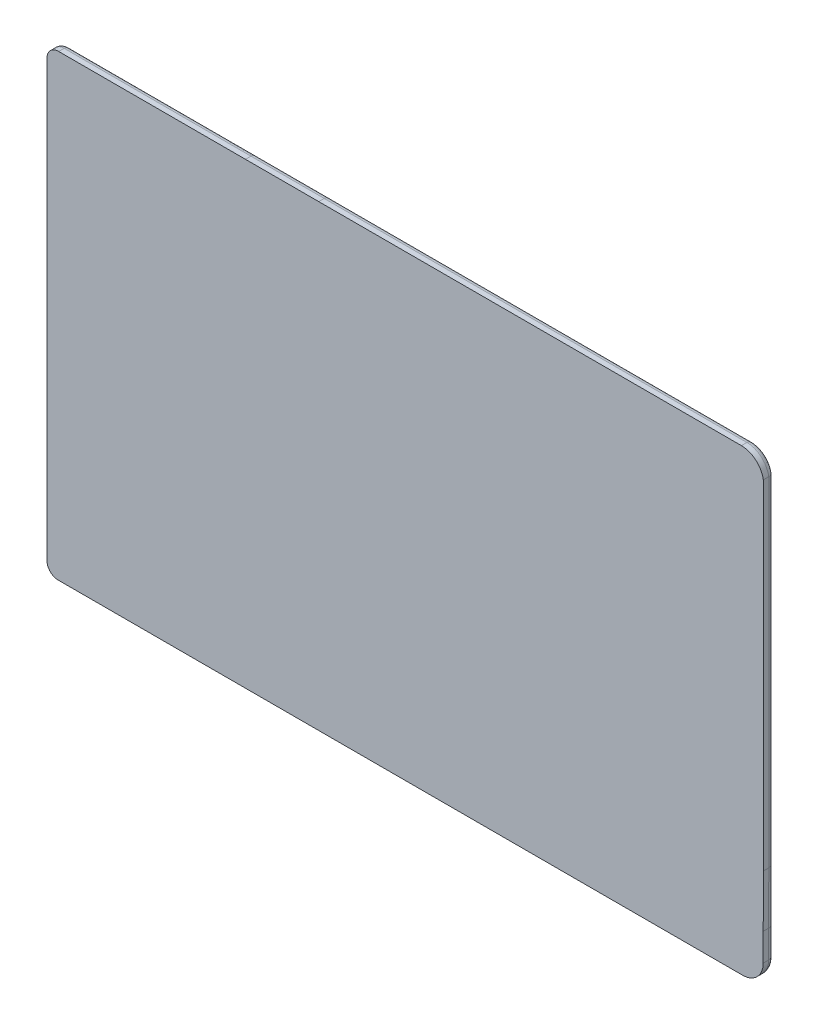
ISO-10303-21;
HEADER;
FILE_DESCRIPTION(('STEP AP214'),'2;1');
FILE_NAME('part.step','',(''),(''),'','','');
FILE_SCHEMA(('AUTOMOTIVE_DESIGN { 1 0 10303 214 1 1 1 1 }'));
ENDSEC;
DATA;
#1=APPLICATION_CONTEXT('core data for automotive mechanical design processes');
#2=APPLICATION_PROTOCOL_DEFINITION('international standard','automotive_design',2000,#1);
#3=PRODUCT_CONTEXT('',#1,'mechanical');
#4=PRODUCT('Part','Part','',(#3));
#5=PRODUCT_RELATED_PRODUCT_CATEGORY('part','',(#4));
#6=PRODUCT_DEFINITION_FORMATION('','',#4);
#7=PRODUCT_DEFINITION_CONTEXT('part definition',#1,'design');
#8=PRODUCT_DEFINITION('design','',#6,#7);
#9=PRODUCT_DEFINITION_SHAPE('','',#8);
#10=(LENGTH_UNIT() NAMED_UNIT(*) SI_UNIT(.MILLI.,.METRE.));
#11=(NAMED_UNIT(*) PLANE_ANGLE_UNIT() SI_UNIT($,.RADIAN.));
#12=(NAMED_UNIT(*) SI_UNIT($,.STERADIAN.) SOLID_ANGLE_UNIT());
#13=UNCERTAINTY_MEASURE_WITH_UNIT(LENGTH_MEASURE(1.E-05),#10,'distance_accuracy_value','');
#14=(GEOMETRIC_REPRESENTATION_CONTEXT(3) GLOBAL_UNCERTAINTY_ASSIGNED_CONTEXT((#13)) GLOBAL_UNIT_ASSIGNED_CONTEXT((#10,
#11,#12)) REPRESENTATION_CONTEXT('',''));
#15=CARTESIAN_POINT('',(0.,0.,0.));
#16=DIRECTION('',(0.,0.,1.));
#17=DIRECTION('',(1.,0.,0.));
#18=AXIS2_PLACEMENT_3D('',#15,#16,#17);
#19=CARTESIAN_POINT('',(-23.7559458215507,0.,2.));
#20=DIRECTION('',(1.,0.,0.));
#21=DIRECTION('',(0.,0.,-1.));
#22=AXIS2_PLACEMENT_3D('',#19,#20,#21);
#23=PLANE('',#22);
#24=DIRECTION('',(0.,0.,-1.));
#25=VECTOR('',#24,1.);
#26=CARTESIAN_POINT('',(-23.7559458215503,15.1458088728289,2.));
#27=LINE('',#26,#25);
#28=CARTESIAN_POINT('',(-23.7559458215503,15.1458088728289,2.));
#29=VERTEX_POINT('',#28);
#30=CARTESIAN_POINT('',(-23.7559458215503,15.1458088728289,1.));
#31=VERTEX_POINT('',#30);
#32=EDGE_CURVE('E684',#29,#31,#27,.T.);
#33=ORIENTED_EDGE('',*,*,#32,.T.);
#34=DIRECTION('',(0.,-1.,0.));
#35=VECTOR('',#34,1.);
#36=CARTESIAN_POINT('',(-23.7559458215507,0.,1.));
#37=LINE('',#36,#35);
#38=CARTESIAN_POINT('',(-23.7559458215507,-64.437268727397,1.));
#39=VERTEX_POINT('',#38);
#40=EDGE_CURVE('E11',#31,#39,#37,.T.);
#41=ORIENTED_EDGE('',*,*,#40,.T.);
#42=DIRECTION('',(0.,0.,-1.));
#43=VECTOR('',#42,1.);
#44=CARTESIAN_POINT('',(-23.7559458215507,-64.437268727397,2.));
#45=LINE('',#44,#43);
#46=CARTESIAN_POINT('',(-23.7559458215507,-64.437268727397,2.));
#47=VERTEX_POINT('',#46);
#48=EDGE_CURVE('E169',#47,#39,#45,.T.);
#49=ORIENTED_EDGE('',*,*,#48,.F.);
#50=DIRECTION('',(0.,-1.,0.));
#51=VECTOR('',#50,1.);
#52=CARTESIAN_POINT('',(-23.7559458215507,0.,2.));
#53=LINE('',#52,#51);
#54=EDGE_CURVE('E176',#29,#47,#53,.T.);
#55=ORIENTED_EDGE('',*,*,#54,.F.);
#56=EDGE_LOOP('',(#33,#41,#49,#55));
#57=FACE_BOUND('',#56,.T.);
#58=ADVANCED_FACE('F37',(#57),#23,.F.);
#59=CARTESIAN_POINT('',(-21.6951147542811,-64.437268727397,2.));
#60=DIRECTION('',(0.,0.,-1.));
#61=DIRECTION('',(-1.,0.,0.));
#62=AXIS2_PLACEMENT_3D('',#59,#60,#61);
#63=CYLINDRICAL_SURFACE('',#62,2.06083106726956);
#64=ORIENTED_EDGE('',*,*,#48,.T.);
#65=CARTESIAN_POINT('',(-21.6951147542811,-64.437268727397,1.));
#66=DIRECTION('',(0.,0.,1.));
#67=DIRECTION('',(1.,0.,0.));
#68=AXIS2_PLACEMENT_3D('',#65,#66,#67);
#69=CIRCLE('',#68,2.06083106726956);
#70=CARTESIAN_POINT('',(-21.7196508215789,-66.497953727397,1.));
#71=VERTEX_POINT('',#70);
#72=EDGE_CURVE('E186',#39,#71,#69,.T.);
#73=ORIENTED_EDGE('',*,*,#72,.T.);
#74=DIRECTION('',(0.,0.,-1.));
#75=VECTOR('',#74,1.);
#76=CARTESIAN_POINT('',(-21.7196508215789,-66.497953727397,2.));
#77=LINE('',#76,#75);
#78=CARTESIAN_POINT('',(-21.7196508215789,-66.497953727397,2.));
#79=VERTEX_POINT('',#78);
#80=EDGE_CURVE('E172',#79,#71,#77,.T.);
#81=ORIENTED_EDGE('',*,*,#80,.F.);
#82=CARTESIAN_POINT('',(-21.6951147542811,-64.437268727397,2.));
#83=DIRECTION('',(0.,0.,1.));
#84=DIRECTION('',(1.,0.,0.));
#85=AXIS2_PLACEMENT_3D('',#82,#83,#84);
#86=CIRCLE('',#85,2.06083106726956);
#87=EDGE_CURVE('E164',#47,#79,#86,.T.);
#88=ORIENTED_EDGE('',*,*,#87,.F.);
#89=EDGE_LOOP('',(#64,#73,#81,#88));
#90=FACE_BOUND('',#89,.T.);
#91=ADVANCED_FACE('F166',(#90),#63,.T.);
#92=CARTESIAN_POINT('',(0.,-66.497953727397,2.));
#93=DIRECTION('',(0.,1.,0.));
#94=DIRECTION('',(0.,0.,1.));
#95=AXIS2_PLACEMENT_3D('',#92,#93,#94);
#96=PLANE('',#95);
#97=ORIENTED_EDGE('',*,*,#80,.T.);
#98=DIRECTION('',(1.,0.,0.));
#99=VECTOR('',#98,1.);
#100=CARTESIAN_POINT('',(0.,-66.497953727397,1.));
#101=LINE('',#100,#99);
#102=CARTESIAN_POINT('',(103.24205417845,-66.497953727397,1.));
#103=VERTEX_POINT('',#102);
#104=EDGE_CURVE('E218',#71,#103,#101,.T.);
#105=ORIENTED_EDGE('',*,*,#104,.T.);
#106=DIRECTION('',(0.,0.,-1.));
#107=VECTOR('',#106,1.);
#108=CARTESIAN_POINT('',(103.24205417845,-66.497953727397,2.));
#109=LINE('',#108,#107);
#110=CARTESIAN_POINT('',(103.24205417845,-66.497953727397,2.));
#111=VERTEX_POINT('',#110);
#112=EDGE_CURVE('E190',#111,#103,#109,.T.);
#113=ORIENTED_EDGE('',*,*,#112,.F.);
#114=DIRECTION('',(1.,0.,0.));
#115=VECTOR('',#114,1.);
#116=CARTESIAN_POINT('',(0.,-66.497953727397,2.));
#117=LINE('',#116,#115);
#118=EDGE_CURVE('E175',#79,#111,#117,.T.);
#119=ORIENTED_EDGE('',*,*,#118,.F.);
#120=EDGE_LOOP('',(#97,#105,#113,#119));
#121=FACE_BOUND('',#120,.T.);
#122=ADVANCED_FACE('F419',(#121),#96,.F.);
#123=CARTESIAN_POINT('',(103.423842226485,-62.693713227397,2.));
#124=DIRECTION('',(0.,0.,-1.));
#125=DIRECTION('',(-1.,0.,0.));
#126=AXIS2_PLACEMENT_3D('',#123,#124,#125);
#127=CYLINDRICAL_SURFACE('',#126,3.80858145196458);
#128=ORIENTED_EDGE('',*,*,#112,.T.);
#129=CARTESIAN_POINT('',(103.423842226485,-62.693713227397,1.));
#130=DIRECTION('',(0.,0.,1.));
#131=DIRECTION('',(1.,0.,0.));
#132=AXIS2_PLACEMENT_3D('',#129,#130,#131);
#133=CIRCLE('',#132,3.80858145196458);
#134=CARTESIAN_POINT('',(107.23242367845,-62.693713227397,1.));
#135=VERTEX_POINT('',#134);
#136=EDGE_CURVE('E220',#103,#135,#133,.T.);
#137=ORIENTED_EDGE('',*,*,#136,.T.);
#138=DIRECTION('',(0.,0.,-1.));
#139=VECTOR('',#138,1.);
#140=CARTESIAN_POINT('',(107.23242367845,-62.693713227397,2.));
#141=LINE('',#140,#139);
#142=CARTESIAN_POINT('',(107.23242367845,-62.693713227397,2.));
#143=VERTEX_POINT('',#142);
#144=EDGE_CURVE('E381',#143,#135,#141,.T.);
#145=ORIENTED_EDGE('',*,*,#144,.F.);
#146=CARTESIAN_POINT('',(103.423842226485,-62.693713227397,2.));
#147=DIRECTION('',(0.,0.,1.));
#148=DIRECTION('',(1.,0.,0.));
#149=AXIS2_PLACEMENT_3D('',#146,#147,#148);
#150=CIRCLE('',#149,3.80858145196458);
#151=EDGE_CURVE('E390',#143,#111,#150,.F.);
#152=ORIENTED_EDGE('',*,*,#151,.T.);
#153=EDGE_LOOP('',(#128,#137,#145,#152));
#154=FACE_BOUND('',#153,.T.);
#155=ADVANCED_FACE('F388',(#154),#127,.T.);
#156=CARTESIAN_POINT('',(107.23242367845,0.,2.));
#157=DIRECTION('',(-1.,0.,0.));
#158=DIRECTION('',(0.,0.,1.));
#159=AXIS2_PLACEMENT_3D('',#156,#157,#158);
#160=PLANE('',#159);
#161=ORIENTED_EDGE('',*,*,#144,.T.);
#162=DIRECTION('',(0.,1.,0.));
#163=VECTOR('',#162,1.);
#164=CARTESIAN_POINT('',(107.23242367845,0.,1.));
#165=LINE('',#164,#163);
#166=CARTESIAN_POINT('',(107.23242367845,-57.6479667005713,1.));
#167=VERTEX_POINT('',#166);
#168=EDGE_CURVE('E222',#135,#167,#165,.T.);
#169=ORIENTED_EDGE('',*,*,#168,.T.);
#170=DIRECTION('',(0.,0.,-1.));
#171=VECTOR('',#170,1.);
#172=CARTESIAN_POINT('',(107.23242367845,-57.6479667005713,2.));
#173=LINE('',#172,#171);
#174=CARTESIAN_POINT('',(107.23242367845,-57.6479667005713,2.));
#175=VERTEX_POINT('',#174);
#176=EDGE_CURVE('E344',#175,#167,#173,.T.);
#177=ORIENTED_EDGE('',*,*,#176,.F.);
#178=DIRECTION('',(0.,1.,0.));
#179=VECTOR('',#178,1.);
#180=CARTESIAN_POINT('',(107.23242367845,0.,2.));
#181=LINE('',#180,#179);
#182=EDGE_CURVE('E700',#143,#175,#181,.T.);
#183=ORIENTED_EDGE('',*,*,#182,.F.);
#184=EDGE_LOOP('',(#161,#169,#177,#183));
#185=FACE_BOUND('',#184,.T.);
#186=ADVANCED_FACE('F426',(#185),#160,.F.);
#187=CARTESIAN_POINT('',(107.290484521769,-0.108262217670973,2.));
#188=DIRECTION('',(-0.999999490902344,0.0010090565164049,0.));
#189=DIRECTION('',(-0.0010090565164049,-0.999999490902344,0.));
#190=AXIS2_PLACEMENT_3D('',#187,#188,#189);
#191=PLANE('',#190);
#192=ORIENTED_EDGE('',*,*,#176,.T.);
#193=DIRECTION('',(0.0010090565164049,0.999999490902344,0.));
#194=VECTOR('',#193,1.);
#195=CARTESIAN_POINT('',(107.290484521769,-0.108262217670973,1.));
#196=LINE('',#195,#194);
#197=CARTESIAN_POINT('',(107.24205417845,-48.1039075318432,1.));
#198=VERTEX_POINT('',#197);
#199=EDGE_CURVE('E224',#167,#198,#196,.T.);
#200=ORIENTED_EDGE('',*,*,#199,.T.);
#201=DIRECTION('',(0.,0.,-1.));
#202=VECTOR('',#201,1.);
#203=CARTESIAN_POINT('',(107.24205417845,-48.1039075318432,2.));
#204=LINE('',#203,#202);
#205=CARTESIAN_POINT('',(107.24205417845,-48.1039075318432,2.));
#206=VERTEX_POINT('',#205);
#207=EDGE_CURVE('E341',#206,#198,#204,.T.);
#208=ORIENTED_EDGE('',*,*,#207,.F.);
#209=DIRECTION('',(0.0010090565164049,0.999999490902344,0.));
#210=VECTOR('',#209,1.);
#211=CARTESIAN_POINT('',(107.290484521769,-0.108262217670973,2.));
#212=LINE('',#211,#210);
#213=EDGE_CURVE('E698',#175,#206,#212,.T.);
#214=ORIENTED_EDGE('',*,*,#213,.F.);
#215=EDGE_LOOP('',(#192,#200,#208,#214));
#216=FACE_BOUND('',#215,.T.);
#217=ADVANCED_FACE('F339',(#216),#191,.F.);
#218=CARTESIAN_POINT('',(107.24205417845,0.,2.));
#219=DIRECTION('',(-1.,0.,0.));
#220=DIRECTION('',(0.,0.,1.));
#221=AXIS2_PLACEMENT_3D('',#218,#219,#220);
#222=PLANE('',#221);
#223=ORIENTED_EDGE('',*,*,#207,.T.);
#224=DIRECTION('',(0.,1.,0.));
#225=VECTOR('',#224,1.);
#226=CARTESIAN_POINT('',(107.24205417845,0.,1.));
#227=LINE('',#226,#225);
#228=CARTESIAN_POINT('',(107.24205417845,13.858111772603,1.));
#229=VERTEX_POINT('',#228);
#230=EDGE_CURVE('E226',#198,#229,#227,.T.);
#231=ORIENTED_EDGE('',*,*,#230,.T.);
#232=DIRECTION('',(0.,0.,-1.));
#233=VECTOR('',#232,1.);
#234=CARTESIAN_POINT('',(107.24205417845,13.858111772603,2.));
#235=LINE('',#234,#233);
#236=CARTESIAN_POINT('',(107.24205417845,13.858111772603,2.));
#237=VERTEX_POINT('',#236);
#238=EDGE_CURVE('E351',#237,#229,#235,.T.);
#239=ORIENTED_EDGE('',*,*,#238,.F.);
#240=DIRECTION('',(0.,1.,0.));
#241=VECTOR('',#240,1.);
#242=CARTESIAN_POINT('',(107.24205417845,0.,2.));
#243=LINE('',#242,#241);
#244=EDGE_CURVE('E350',#206,#237,#243,.T.);
#245=ORIENTED_EDGE('',*,*,#244,.F.);
#246=EDGE_LOOP('',(#223,#231,#239,#245));
#247=FACE_BOUND('',#246,.T.);
#248=ADVANCED_FACE('F347',(#247),#222,.F.);
#249=CARTESIAN_POINT('',(103.24205417845,13.2215934347007,2.));
#250=DIRECTION('',(0.,0.,-1.));
#251=DIRECTION('',(-1.,0.,0.));
#252=AXIS2_PLACEMENT_3D('',#249,#250,#251);
#253=CYLINDRICAL_SURFACE('',#252,4.05032783790225);
#254=ORIENTED_EDGE('',*,*,#238,.T.);
#255=CARTESIAN_POINT('',(103.24205417845,13.2215934347007,1.));
#256=DIRECTION('',(0.,0.,1.));
#257=DIRECTION('',(1.,0.,0.));
#258=AXIS2_PLACEMENT_3D('',#255,#256,#257);
#259=CIRCLE('',#258,4.05032783790225);
#260=CARTESIAN_POINT('',(103.24205417845,17.271921272603,1.));
#261=VERTEX_POINT('',#260);
#262=EDGE_CURVE('E228',#229,#261,#259,.T.);
#263=ORIENTED_EDGE('',*,*,#262,.T.);
#264=DIRECTION('',(0.,0.,-1.));
#265=VECTOR('',#264,1.);
#266=CARTESIAN_POINT('',(103.24205417845,17.271921272603,2.));
#267=LINE('',#266,#265);
#268=CARTESIAN_POINT('',(103.24205417845,17.271921272603,2.));
#269=VERTEX_POINT('',#268);
#270=EDGE_CURVE('E365',#269,#261,#267,.T.);
#271=ORIENTED_EDGE('',*,*,#270,.F.);
#272=CARTESIAN_POINT('',(103.24205417845,13.2215934347007,2.));
#273=DIRECTION('',(0.,0.,1.));
#274=DIRECTION('',(1.,0.,0.));
#275=AXIS2_PLACEMENT_3D('',#272,#273,#274);
#276=CIRCLE('',#275,4.05032783790225);
#277=EDGE_CURVE('E695',#269,#237,#276,.F.);
#278=ORIENTED_EDGE('',*,*,#277,.T.);
#279=EDGE_LOOP('',(#254,#263,#271,#278));
#280=FACE_BOUND('',#279,.T.);
#281=ADVANCED_FACE('F363',(#280),#253,.T.);
#282=CARTESIAN_POINT('',(0.,17.271921272603,2.));
#283=DIRECTION('',(0.,1.,0.));
#284=DIRECTION('',(0.,0.,1.));
#285=AXIS2_PLACEMENT_3D('',#282,#283,#284);
#286=PLANE('',#285);
#287=ORIENTED_EDGE('',*,*,#270,.T.);
#288=DIRECTION('',(1.,0.,0.));
#289=VECTOR('',#288,1.);
#290=CARTESIAN_POINT('',(25.94605417845,17.271921272603,1.));
#291=LINE('',#290,#289);
#292=CARTESIAN_POINT('',(25.94605417845,17.271921272603,1.));
#293=VERTEX_POINT('',#292);
#294=EDGE_CURVE('E230',#261,#293,#291,.F.);
#295=ORIENTED_EDGE('',*,*,#294,.T.);
#296=DIRECTION('',(0.,0.,-1.));
#297=VECTOR('',#296,1.);
#298=CARTESIAN_POINT('',(25.94605417845,17.271921272603,2.));
#299=LINE('',#298,#297);
#300=CARTESIAN_POINT('',(25.94605417845,17.271921272603,2.));
#301=VERTEX_POINT('',#300);
#302=EDGE_CURVE('E373',#301,#293,#299,.T.);
#303=ORIENTED_EDGE('',*,*,#302,.F.);
#304=DIRECTION('',(1.,0.,0.));
#305=VECTOR('',#304,1.);
#306=CARTESIAN_POINT('',(0.,17.271921272603,2.));
#307=LINE('',#306,#305);
#308=EDGE_CURVE('E372',#301,#269,#307,.T.);
#309=ORIENTED_EDGE('',*,*,#308,.T.);
#310=EDGE_LOOP('',(#287,#295,#303,#309));
#311=FACE_BOUND('',#310,.T.);
#312=ADVANCED_FACE('F369',(#311),#286,.T.);
#313=CARTESIAN_POINT('',(-0.00203875620281152,17.2688578484967,2.));
#314=DIRECTION('',(-0.000118059700675464,0.999999993030954,0.));
#315=DIRECTION('',(-0.999999993030954,-0.000118059700675464,0.));
#316=AXIS2_PLACEMENT_3D('',#313,#314,#315);
#317=PLANE('',#316);
#318=ORIENTED_EDGE('',*,*,#302,.T.);
#319=DIRECTION('',(0.999999993030954,0.000118059700675464,0.));
#320=VECTOR('',#319,1.);
#321=CARTESIAN_POINT('',(12.5460541784495,17.2703392726029,1.));
#322=LINE('',#321,#320);
#323=CARTESIAN_POINT('',(12.5460541784495,17.2703392726029,1.));
#324=VERTEX_POINT('',#323);
#325=EDGE_CURVE('E232',#293,#324,#322,.F.);
#326=ORIENTED_EDGE('',*,*,#325,.T.);
#327=DIRECTION('',(0.,0.,-1.));
#328=VECTOR('',#327,1.);
#329=CARTESIAN_POINT('',(12.5460541784495,17.2703392726029,2.));
#330=LINE('',#329,#328);
#331=CARTESIAN_POINT('',(12.5460541784495,17.2703392726029,2.));
#332=VERTEX_POINT('',#331);
#333=EDGE_CURVE('E376',#332,#324,#330,.T.);
#334=ORIENTED_EDGE('',*,*,#333,.F.);
#335=DIRECTION('',(0.999999993030954,0.000118059700675464,0.));
#336=VECTOR('',#335,1.);
#337=CARTESIAN_POINT('',(-0.00203875620281152,17.2688578484967,2.));
#338=LINE('',#337,#336);
#339=EDGE_CURVE('E691',#332,#301,#338,.T.);
#340=ORIENTED_EDGE('',*,*,#339,.T.);
#341=EDGE_LOOP('',(#318,#326,#334,#340));
#342=FACE_BOUND('',#341,.T.);
#343=ADVANCED_FACE('F438',(#342),#317,.T.);
#344=CARTESIAN_POINT('',(0.,17.2703392726029,2.));
#345=DIRECTION('',(0.,-1.,0.));
#346=DIRECTION('',(1.,0.,0.));
#347=AXIS2_PLACEMENT_3D('',#344,#345,#346);
#348=PLANE('',#347);
#349=ORIENTED_EDGE('',*,*,#333,.T.);
#350=DIRECTION('',(-1.,0.,0.));
#351=VECTOR('',#350,1.);
#352=CARTESIAN_POINT('',(0.,17.2703392726029,1.));
#353=LINE('',#352,#351);
#354=CARTESIAN_POINT('',(-21.6069358215433,17.2703392726029,1.));
#355=VERTEX_POINT('',#354);
#356=EDGE_CURVE('E61',#324,#355,#353,.T.);
#357=ORIENTED_EDGE('',*,*,#356,.T.);
#358=DIRECTION('',(0.,0.,-1.));
#359=VECTOR('',#358,1.);
#360=CARTESIAN_POINT('',(-21.6069358215433,17.2703392726029,2.));
#361=LINE('',#360,#359);
#362=CARTESIAN_POINT('',(-21.6069358215433,17.2703392726029,2.));
#363=VERTEX_POINT('',#362);
#364=EDGE_CURVE('E682',#363,#355,#361,.T.);
#365=ORIENTED_EDGE('',*,*,#364,.F.);
#366=DIRECTION('',(-1.,0.,0.));
#367=VECTOR('',#366,1.);
#368=CARTESIAN_POINT('',(0.,17.2703392726029,2.));
#369=LINE('',#368,#367);
#370=EDGE_CURVE('E689',#332,#363,#369,.T.);
#371=ORIENTED_EDGE('',*,*,#370,.F.);
#372=EDGE_LOOP('',(#349,#357,#365,#371));
#373=FACE_BOUND('',#372,.T.);
#374=ADVANCED_FACE('F441',(#373),#348,.F.);
#375=CARTESIAN_POINT('',(-21.6312759969185,15.1458088728289,2.));
#376=DIRECTION('',(0.,0.,-1.));
#377=DIRECTION('',(-1.,0.,0.));
#378=AXIS2_PLACEMENT_3D('',#375,#376,#377);
#379=CYLINDRICAL_SURFACE('',#378,2.12466982463184);
#380=ORIENTED_EDGE('',*,*,#364,.T.);
#381=CARTESIAN_POINT('',(-21.6312759969185,15.1458088728289,1.));
#382=DIRECTION('',(0.,0.,1.));
#383=DIRECTION('',(1.,0.,0.));
#384=AXIS2_PLACEMENT_3D('',#381,#382,#383);
#385=CIRCLE('',#384,2.12466982463184);
#386=EDGE_CURVE('E46',#355,#31,#385,.T.);
#387=ORIENTED_EDGE('',*,*,#386,.T.);
#388=ORIENTED_EDGE('',*,*,#32,.F.);
#389=CARTESIAN_POINT('',(-21.6312759969185,15.1458088728289,2.));
#390=DIRECTION('',(0.,0.,1.));
#391=DIRECTION('',(1.,0.,0.));
#392=AXIS2_PLACEMENT_3D('',#389,#390,#391);
#393=CIRCLE('',#392,2.12466982463184);
#394=EDGE_CURVE('E182',#29,#363,#393,.F.);
#395=ORIENTED_EDGE('',*,*,#394,.T.);
#396=EDGE_LOOP('',(#380,#387,#388,#395));
#397=FACE_BOUND('',#396,.T.);
#398=ADVANCED_FACE('F445',(#397),#379,.T.);
#399=CARTESIAN_POINT('',(0.,0.,2.));
#400=DIRECTION('',(0.,0.,1.));
#401=DIRECTION('',(1.,0.,0.));
#402=AXIS2_PLACEMENT_3D('',#399,#400,#401);
#403=PLANE('',#402);
#404=ORIENTED_EDGE('',*,*,#54,.T.);
#405=ORIENTED_EDGE('',*,*,#87,.T.);
#406=ORIENTED_EDGE('',*,*,#118,.T.);
#407=ORIENTED_EDGE('',*,*,#151,.F.);
#408=ORIENTED_EDGE('',*,*,#182,.T.);
#409=ORIENTED_EDGE('',*,*,#213,.T.);
#410=ORIENTED_EDGE('',*,*,#244,.T.);
#411=ORIENTED_EDGE('',*,*,#277,.F.);
#412=ORIENTED_EDGE('',*,*,#308,.F.);
#413=ORIENTED_EDGE('',*,*,#339,.F.);
#414=ORIENTED_EDGE('',*,*,#370,.T.);
#415=ORIENTED_EDGE('',*,*,#394,.F.);
#416=EDGE_LOOP('',(#404,#405,#406,#407,#408,#409,#410,#411,#412,#413,#414,#415));
#417=FACE_BOUND('',#416,.T.);
#418=ADVANCED_FACE('F180',(#417),#403,.T.);
#419=CARTESIAN_POINT('',(0.,0.,0.));
#420=DIRECTION('',(0.,0.,1.));
#421=DIRECTION('',(1.,0.,0.));
#422=AXIS2_PLACEMENT_3D('',#419,#420,#421);
#423=PLANE('',#422);
#424=DIRECTION('',(1.,0.,0.));
#425=VECTOR('',#424,1.);
#426=CARTESIAN_POINT('',(0.,-65.497953727397,0.));
#427=LINE('',#426,#425);
#428=CARTESIAN_POINT('',(103.267749335938,-65.497953727397,0.));
#429=VERTEX_POINT('',#428);
#430=CARTESIAN_POINT('',(-21.7127182783402,-65.497953727397,0.));
#431=VERTEX_POINT('',#430);
#432=EDGE_CURVE('E213',#429,#431,#427,.F.);
#433=ORIENTED_EDGE('',*,*,#432,.T.);
#434=CARTESIAN_POINT('',(-21.6951147542811,-64.437268727397,0.));
#435=DIRECTION('',(0.,0.,1.));
#436=DIRECTION('',(1.,0.,0.));
#437=AXIS2_PLACEMENT_3D('',#434,#435,#436);
#438=CIRCLE('',#437,1.06083106726956);
#439=CARTESIAN_POINT('',(-22.7559458215507,-64.437268727397,0.));
#440=VERTEX_POINT('',#439);
#441=EDGE_CURVE('E215',#431,#440,#438,.F.);
#442=ORIENTED_EDGE('',*,*,#441,.T.);
#443=DIRECTION('',(0.,-1.,0.));
#444=VECTOR('',#443,1.);
#445=CARTESIAN_POINT('',(-22.7559458215507,0.,0.));
#446=LINE('',#445,#444);
#447=CARTESIAN_POINT('',(-22.7559458215507,15.1458088728289,0.));
#448=VERTEX_POINT('',#447);
#449=EDGE_CURVE('E188',#440,#448,#446,.F.);
#450=ORIENTED_EDGE('',*,*,#449,.T.);
#451=CARTESIAN_POINT('',(-21.6312759969185,15.1458088728289,0.));
#452=DIRECTION('',(0.,0.,1.));
#453=DIRECTION('',(1.,0.,0.));
#454=AXIS2_PLACEMENT_3D('',#451,#452,#453);
#455=CIRCLE('',#454,1.12466982463184);
#456=CARTESIAN_POINT('',(-21.6135673995268,16.2703392726029,0.));
#457=VERTEX_POINT('',#456);
#458=EDGE_CURVE('E195',#448,#457,#455,.F.);
#459=ORIENTED_EDGE('',*,*,#458,.T.);
#460=DIRECTION('',(-1.,0.,0.));
#461=VECTOR('',#460,1.);
#462=CARTESIAN_POINT('',(0.,16.2703392726029,0.));
#463=LINE('',#462,#461);
#464=CARTESIAN_POINT('',(12.5461722381502,16.2703392726029,0.));
#465=VERTEX_POINT('',#464);
#466=EDGE_CURVE('E197',#457,#465,#463,.F.);
#467=ORIENTED_EDGE('',*,*,#466,.T.);
#468=DIRECTION('',(0.999999993030954,0.000118059700675464,0.));
#469=VECTOR('',#468,1.);
#470=CARTESIAN_POINT('',(25.9461722381506,16.271921279572,0.));
#471=LINE('',#470,#469);
#472=CARTESIAN_POINT('',(25.9460541784508,16.2719212656339,0.));
#473=VERTEX_POINT('',#472);
#474=EDGE_CURVE('E199',#465,#473,#471,.T.);
#475=ORIENTED_EDGE('',*,*,#474,.T.);
#476=DIRECTION('',(1.,0.,0.));
#477=VECTOR('',#476,1.);
#478=CARTESIAN_POINT('',(103.24205417845,16.271921272603,0.));
#479=LINE('',#478,#477);
#480=CARTESIAN_POINT('',(103.24205417845,16.271921272603,0.));
#481=VERTEX_POINT('',#480);
#482=EDGE_CURVE('E201',#473,#481,#479,.T.);
#483=ORIENTED_EDGE('',*,*,#482,.T.);
#484=CARTESIAN_POINT('',(103.24205417845,13.2215934347007,0.));
#485=DIRECTION('',(0.,0.,1.));
#486=DIRECTION('',(1.,0.,0.));
#487=AXIS2_PLACEMENT_3D('',#484,#485,#486);
#488=CIRCLE('',#487,3.05032783790225);
#489=CARTESIAN_POINT('',(106.24205417845,13.7734085474707,0.));
#490=VERTEX_POINT('',#489);
#491=EDGE_CURVE('E203',#481,#490,#488,.F.);
#492=ORIENTED_EDGE('',*,*,#491,.T.);
#493=DIRECTION('',(0.,1.,0.));
#494=VECTOR('',#493,1.);
#495=CARTESIAN_POINT('',(106.24205417845,0.,0.));
#496=LINE('',#495,#494);
#497=CARTESIAN_POINT('',(106.24205417845,-48.1028984753268,0.));
#498=VERTEX_POINT('',#497);
#499=EDGE_CURVE('E205',#490,#498,#496,.F.);
#500=ORIENTED_EDGE('',*,*,#499,.T.);
#501=DIRECTION('',(0.0010090565164049,0.999999490902344,0.));
#502=VECTOR('',#501,1.);
#503=CARTESIAN_POINT('',(106.290485030866,-0.107253161154566,0.));
#504=LINE('',#503,#502);
#505=CARTESIAN_POINT('',(106.232423169352,-57.6479667000576,0.));
#506=VERTEX_POINT('',#505);
#507=EDGE_CURVE('E207',#498,#506,#504,.F.);
#508=ORIENTED_EDGE('',*,*,#507,.T.);
#509=DIRECTION('',(0.,1.,0.));
#510=VECTOR('',#509,1.);
#511=CARTESIAN_POINT('',(106.23242367845,0.,0.));
#512=LINE('',#511,#510);
#513=CARTESIAN_POINT('',(106.23242367845,-62.693713227397,0.));
#514=VERTEX_POINT('',#513);
#515=EDGE_CURVE('E209',#506,#514,#512,.F.);
#516=ORIENTED_EDGE('',*,*,#515,.T.);
#517=CARTESIAN_POINT('',(103.423842226485,-62.693713227397,0.));
#518=DIRECTION('',(0.,0.,1.));
#519=DIRECTION('',(1.,0.,0.));
#520=AXIS2_PLACEMENT_3D('',#517,#518,#519);
#521=CIRCLE('',#520,2.80858145196458);
#522=EDGE_CURVE('E211',#514,#429,#521,.F.);
#523=ORIENTED_EDGE('',*,*,#522,.T.);
#524=EDGE_LOOP('',(#433,#442,#450,#459,#467,#475,#483,#492,#500,#508,#516,#523));
#525=FACE_BOUND('',#524,.T.);
#526=ADVANCED_FACE('F307',(#525),#423,.F.);
#527=CARTESIAN_POINT('',(103.24205417845,13.2215934347007,1.));
#528=DIRECTION('',(0.,0.,1.));
#529=DIRECTION('',(1.,0.,0.));
#530=AXIS2_PLACEMENT_3D('',#527,#528,#529);
#531=TOROIDAL_SURFACE('',#530,3.05032783790225,1.);
#532=CARTESIAN_POINT('',(107.24205417845,13.858111772603,1.));
#533=CARTESIAN_POINT('',(107.24205403706,13.8581116948124,0.971932232129498));
#534=CARTESIAN_POINT('',(107.240871733216,13.858018287248,0.943877931185985));
#535=CARTESIAN_POINT('',(107.236155350248,13.8576452370416,0.887970502591521));
#536=CARTESIAN_POINT('',(107.232621396598,13.8573656043357,0.860117364287544));
#537=CARTESIAN_POINT('',(107.218526336588,13.8562492291716,0.777208537297618));
#538=CARTESIAN_POINT('',(107.204471934713,13.8551350055905,0.722708945130684));
#539=CARTESIAN_POINT('',(107.167445180802,13.8521867488144,0.6168532489345));
#540=CARTESIAN_POINT('',(107.14446882061,13.8503523920982,0.565498569767128));
#541=CARTESIAN_POINT('',(107.09026389707,13.8459985653693,0.467384917917775));
#542=CARTESIAN_POINT('',(107.059037096845,13.8434792417308,0.420624966266855));
#543=CARTESIAN_POINT('',(106.98918356069,13.8378002074094,0.332959084799747));
#544=CARTESIAN_POINT('',(106.950547881543,13.8346397225144,0.292060335340584));
#545=CARTESIAN_POINT('',(106.866990255126,13.8277412355994,0.217313949635491));
#546=CARTESIAN_POINT('',(106.822066202559,13.8240030401228,0.183468684323169));
#547=CARTESIAN_POINT('',(106.727073945961,13.8160140863835,0.123691297606742));
#548=CARTESIAN_POINT('',(106.676989584018,13.8117617104373,0.0977851071758415));
#549=CARTESIAN_POINT('',(106.573235725797,13.8028463958117,0.0547667005084664));
#550=CARTESIAN_POINT('',(106.519569219034,13.7981837984779,0.0376472523861343));
#551=CARTESIAN_POINT('',(106.430755441494,13.7903665527423,0.0173386212918974));
#552=CARTESIAN_POINT('',(106.396215227207,13.7873025513229,0.0113327654822973));
#553=CARTESIAN_POINT('',(106.326737570083,13.7810873095245,0.00298011321194723));
#554=CARTESIAN_POINT('',(106.291800829454,13.7779362124022,0.000627634243727407));
#555=CARTESIAN_POINT('',(106.2519263509,13.7743083823133,3.6467357070578E-05));
#556=CARTESIAN_POINT('',(106.246989963097,13.7738587147611,-9.64921963363169E-08));
#557=CARTESIAN_POINT('',(106.24205417845,13.7734085474707,0.));
#558=B_SPLINE_CURVE_WITH_KNOTS('',3,(#532,#533,#534,#535,#536,#537,#538,#539,#540,#541,#542,
#543,#544,#545,#546,#547,#548,#549,#550,#551,#552,#553,#554,#555,#556,#557),.UNSPECIFIED.,.F.,
.F.,(4,2,2,2,2,2,2,2,2,2,2,2,4),(0.,0.0841515160902395,0.168298542577546,0.336312734045551,
0.504402492747552,0.67245635963835,0.840714375151086,1.00902885742858,1.17788737662192,
1.34660669386314,1.45201810862097,1.5572654003613,1.57213565035753),.UNSPECIFIED.);
#559=EDGE_CURVE('E310',#490,#229,#558,.F.);
#560=ORIENTED_EDGE('',*,*,#559,.F.);
#561=ORIENTED_EDGE('',*,*,#491,.F.);
#562=CARTESIAN_POINT('',(103.24205417845,16.271921272603,1.));
#563=DIRECTION('',(-1.,0.,0.));
#564=DIRECTION('',(0.,0.,1.));
#565=AXIS2_PLACEMENT_3D('',#562,#563,#564);
#566=CIRCLE('',#565,1.);
#567=EDGE_CURVE('E41',#261,#481,#566,.T.);
#568=ORIENTED_EDGE('',*,*,#567,.F.);
#569=ORIENTED_EDGE('',*,*,#262,.F.);
#570=EDGE_LOOP('',(#560,#561,#568,#569));
#571=FACE_BOUND('',#570,.T.);
#572=ADVANCED_FACE('F304',(#571),#531,.T.);
#573=CARTESIAN_POINT('',(0.,16.271921272603,1.));
#574=DIRECTION('',(-1.,0.,0.));
#575=DIRECTION('',(0.,0.,1.));
#576=AXIS2_PLACEMENT_3D('',#573,#574,#575);
#577=CYLINDRICAL_SURFACE('',#576,1.);
#578=ORIENTED_EDGE('',*,*,#567,.T.);
#579=ORIENTED_EDGE('',*,*,#482,.F.);
#580=CARTESIAN_POINT('',(25.94605417845,16.271921272603,1.));
#581=DIRECTION('',(-1.,0.,0.));
#582=DIRECTION('',(0.,0.,1.));
#583=AXIS2_PLACEMENT_3D('',#580,#581,#582);
#584=CIRCLE('',#583,1.);
#585=EDGE_CURVE('E317',#293,#473,#584,.T.);
#586=ORIENTED_EDGE('',*,*,#585,.F.);
#587=ORIENTED_EDGE('',*,*,#294,.F.);
#588=EDGE_LOOP('',(#578,#579,#586,#587));
#589=FACE_BOUND('',#588,.T.);
#590=ADVANCED_FACE('F39',(#589),#577,.T.);
#591=CARTESIAN_POINT('',(106.24205417845,0.,1.));
#592=DIRECTION('',(0.,1.,0.));
#593=DIRECTION('',(0.,0.,1.));
#594=AXIS2_PLACEMENT_3D('',#591,#592,#593);
#595=CYLINDRICAL_SURFACE('',#594,1.);
#596=ORIENTED_EDGE('',*,*,#559,.T.);
#597=ORIENTED_EDGE('',*,*,#230,.F.);
#598=CARTESIAN_POINT('',(106.24205417845,-48.1028984753268,1.));
#599=DIRECTION('',(-0.00100905600269809,-0.999999490902862,0.));
#600=DIRECTION('',(0.999999490902862,-0.00100905600269809,0.));
#601=AXIS2_PLACEMENT_3D('',#598,#599,#600);
#602=CIRCLE('',#601,1.);
#603=EDGE_CURVE('E320',#498,#198,#602,.T.);
#604=ORIENTED_EDGE('',*,*,#603,.F.);
#605=ORIENTED_EDGE('',*,*,#499,.F.);
#606=EDGE_LOOP('',(#596,#597,#604,#605));
#607=FACE_BOUND('',#606,.T.);
#608=ADVANCED_FACE('F302',(#607),#595,.T.);
#609=CARTESIAN_POINT('',(-0.00192069650213337,16.2688578554657,1.));
#610=DIRECTION('',(-0.999999993030954,-0.000118059700675464,0.));
#611=DIRECTION('',(0.000118059700675464,-0.999999993030954,0.));
#612=AXIS2_PLACEMENT_3D('',#609,#610,#611);
#613=CYLINDRICAL_SURFACE('',#612,1.);
#614=ORIENTED_EDGE('',*,*,#585,.T.);
#615=ORIENTED_EDGE('',*,*,#474,.F.);
#616=CARTESIAN_POINT('',(12.5461722381502,16.2703392795719,1.));
#617=DIRECTION('',(-0.999999993030953,-0.000118059700675299,0.));
#618=DIRECTION('',(0.000118059700675299,-0.999999993030954,0.));
#619=AXIS2_PLACEMENT_3D('',#616,#617,#618);
#620=CIRCLE('',#619,1.);
#621=EDGE_CURVE('E322',#324,#465,#620,.T.);
#622=ORIENTED_EDGE('',*,*,#621,.F.);
#623=ORIENTED_EDGE('',*,*,#325,.F.);
#624=EDGE_LOOP('',(#614,#615,#622,#623));
#625=FACE_BOUND('',#624,.T.);
#626=ADVANCED_FACE('F298',(#625),#613,.T.);
#627=CARTESIAN_POINT('',(106.290485030866,-0.107253161154568,1.));
#628=DIRECTION('',(0.0010090565164049,0.999999490902344,0.));
#629=DIRECTION('',(-0.999999490902344,0.0010090565164049,0.));
#630=AXIS2_PLACEMENT_3D('',#627,#628,#629);
#631=CYLINDRICAL_SURFACE('',#630,1.);
#632=ORIENTED_EDGE('',*,*,#603,.T.);
#633=ORIENTED_EDGE('',*,*,#199,.F.);
#634=CARTESIAN_POINT('',(106.232423169352,-57.6479667000576,1.));
#635=DIRECTION('',(-5.13706870861129E-10,-1.,0.));
#636=DIRECTION('',(1.,-5.13706870861129E-10,0.));
#637=AXIS2_PLACEMENT_3D('',#634,#635,#636);
#638=CIRCLE('',#637,1.);
#639=EDGE_CURVE('E283',#506,#167,#638,.T.);
#640=ORIENTED_EDGE('',*,*,#639,.F.);
#641=ORIENTED_EDGE('',*,*,#507,.F.);
#642=EDGE_LOOP('',(#632,#633,#640,#641));
#643=FACE_BOUND('',#642,.T.);
#644=ADVANCED_FACE('F295',(#643),#631,.T.);
#645=CARTESIAN_POINT('',(0.,16.2703392726029,1.));
#646=DIRECTION('',(-1.,0.,0.));
#647=DIRECTION('',(0.,-1.,0.));
#648=AXIS2_PLACEMENT_3D('',#645,#646,#647);
#649=CYLINDRICAL_SURFACE('',#648,1.);
#650=ORIENTED_EDGE('',*,*,#621,.T.);
#651=ORIENTED_EDGE('',*,*,#466,.F.);
#652=CARTESIAN_POINT('',(-21.6069358215433,17.2703392726029,1.));
#653=CARTESIAN_POINT('',(-21.6069358318298,17.2703390847421,0.971866705653343));
#654=CARTESIAN_POINT('',(-21.6069426253812,17.269151304041,0.943746890348602));
#655=CARTESIAN_POINT('',(-21.6069697877757,17.2644127627268,0.887708463133258));
#656=CARTESIAN_POINT('',(-21.6069901559693,17.2608621151697,0.859789841660749));
#657=CARTESIAN_POINT('',(-21.6070715512391,17.2466988662928,0.776680252077872));
#658=CARTESIAN_POINT('',(-21.6071528690465,17.2325748701759,0.722046027586155));
#659=CARTESIAN_POINT('',(-21.607368958648,17.1953553273097,0.615925871827345));
#660=CARTESIAN_POINT('',(-21.6075037562345,17.1722554517454,0.564441473520869));
#661=CARTESIAN_POINT('',(-21.6078256445425,17.1177445883602,0.466087377496097));
#662=CARTESIAN_POINT('',(-21.6080127217182,17.0863357535498,0.419216488639804));
#663=CARTESIAN_POINT('',(-21.6084375500851,17.0160999659793,0.331417860991432));
#664=CARTESIAN_POINT('',(-21.6086752972046,16.9772736092958,0.29048964510739));
#665=CARTESIAN_POINT('',(-21.609199529855,16.8932817534389,0.215713966504172));
#666=CARTESIAN_POINT('',(-21.6094860363868,16.8481135242681,0.181869568879558));
#667=CARTESIAN_POINT('',(-21.610105200587,16.7527219990071,0.122233269027813));
#668=CARTESIAN_POINT('',(-21.610437879141,16.7024964181024,0.0964450281972141));
#669=CARTESIAN_POINT('',(-21.6111459941445,16.5984647994398,0.0536981459759779));
#670=CARTESIAN_POINT('',(-21.6115213740972,16.5446635308745,0.0367279995285454));
#671=CARTESIAN_POINT('',(-21.6121162336169,16.4620621782072,0.0181350947701437));
#672=CARTESIAN_POINT('',(-21.6123214861662,16.4339932428372,0.0130696896606099));
#673=CARTESIAN_POINT('',(-21.6127413397033,16.3775481002092,0.00535685730088292));
#674=CARTESIAN_POINT('',(-21.6129559297686,16.3491722796603,0.00270668052271823));
#675=CARTESIAN_POINT('',(-21.6133042408282,16.3039517092385,0.000423159225749937));
#676=CARTESIAN_POINT('',(-21.6134350900937,16.2871436986256,-1.1956219088725E-06));
#677=CARTESIAN_POINT('',(-21.6135673995268,16.2703392726029,0.));
#678=B_SPLINE_CURVE_WITH_KNOTS('',3,(#652,#653,#654,#655,#656,#657,#658,#659,#660,#661,#662,
#663,#664,#665,#666,#667,#668,#669,#670,#671,#672,#673,#674,#675,#676,#677),.UNSPECIFIED.,.F.,
.F.,(4,2,2,2,2,2,2,2,2,2,2,2,4),(0.,0.084348042125769,0.168692048747253,0.337114886958102,
0.505619051797623,0.674079596676014,0.842526609653257,1.01104635791409,1.1796425846979,
1.34801828644525,1.43350266277163,1.51888960054241,1.56930793109738),.UNSPECIFIED.);
#679=EDGE_CURVE('E275',#355,#457,#678,.T.);
#680=ORIENTED_EDGE('',*,*,#679,.F.);
#681=ORIENTED_EDGE('',*,*,#356,.F.);
#682=EDGE_LOOP('',(#650,#651,#680,#681));
#683=FACE_BOUND('',#682,.T.);
#684=ADVANCED_FACE('F285',(#683),#649,.T.);
#685=CARTESIAN_POINT('',(106.23242367845,0.,1.));
#686=DIRECTION('',(0.,1.,0.));
#687=DIRECTION('',(0.,0.,1.));
#688=AXIS2_PLACEMENT_3D('',#685,#686,#687);
#689=CYLINDRICAL_SURFACE('',#688,1.);
#690=ORIENTED_EDGE('',*,*,#639,.T.);
#691=ORIENTED_EDGE('',*,*,#168,.F.);
#692=CARTESIAN_POINT('',(106.23242367845,-62.693713227397,1.));
#693=DIRECTION('',(0.,-1.,0.));
#694=DIRECTION('',(0.,0.,-1.));
#695=AXIS2_PLACEMENT_3D('',#692,#693,#694);
#696=CIRCLE('',#695,1.);
#697=EDGE_CURVE('E272',#514,#135,#696,.T.);
#698=ORIENTED_EDGE('',*,*,#697,.F.);
#699=ORIENTED_EDGE('',*,*,#515,.F.);
#700=EDGE_LOOP('',(#690,#691,#698,#699));
#701=FACE_BOUND('',#700,.T.);
#702=ADVANCED_FACE('F290',(#701),#689,.T.);
#703=CARTESIAN_POINT('',(-21.6312759969185,15.1458088728289,1.));
#704=DIRECTION('',(0.,0.,1.));
#705=DIRECTION('',(1.,0.,0.));
#706=AXIS2_PLACEMENT_3D('',#703,#704,#705);
#707=TOROIDAL_SURFACE('',#706,1.12466982463184,1.);
#708=ORIENTED_EDGE('',*,*,#679,.T.);
#709=ORIENTED_EDGE('',*,*,#458,.F.);
#710=CARTESIAN_POINT('',(-22.7559458215503,15.1458088728289,1.));
#711=DIRECTION('',(0.,-1.,0.));
#712=DIRECTION('',(0.,0.,-1.));
#713=AXIS2_PLACEMENT_3D('',#710,#711,#712);
#714=CIRCLE('',#713,1.);
#715=EDGE_CURVE('E269',#31,#448,#714,.T.);
#716=ORIENTED_EDGE('',*,*,#715,.F.);
#717=ORIENTED_EDGE('',*,*,#386,.F.);
#718=EDGE_LOOP('',(#708,#709,#716,#717));
#719=FACE_BOUND('',#718,.T.);
#720=ADVANCED_FACE('F259',(#719),#707,.T.);
#721=CARTESIAN_POINT('',(103.423842226485,-62.693713227397,1.));
#722=DIRECTION('',(0.,0.,1.));
#723=DIRECTION('',(1.,0.,0.));
#724=AXIS2_PLACEMENT_3D('',#721,#722,#723);
#725=TOROIDAL_SURFACE('',#724,2.80858145196458,1.);
#726=ORIENTED_EDGE('',*,*,#697,.T.);
#727=ORIENTED_EDGE('',*,*,#136,.F.);
#728=CARTESIAN_POINT('',(103.24205417845,-66.497953727397,1.));
#729=CARTESIAN_POINT('',(103.24205420428,-66.4979535437333,0.971872312549345));
#730=CARTESIAN_POINT('',(103.242082532459,-66.496766232008,0.943758103043661));
#731=CARTESIAN_POINT('',(103.242195684201,-66.4920295887998,0.887730886847819));
#732=CARTESIAN_POINT('',(103.242280505032,-66.4884803714835,0.859817870498563));
#733=CARTESIAN_POINT('',(103.242619188215,-66.4743230244972,0.776725808922437));
#734=CARTESIAN_POINT('',(103.242957272305,-66.4602051101404,0.722103447352031));
#735=CARTESIAN_POINT('',(103.243852300239,-66.4230025079939,0.616006759420192));
#736=CARTESIAN_POINT('',(103.244409348315,-66.3999135497902,0.564533945839908));
#737=CARTESIAN_POINT('',(103.245732346207,-66.3454294197635,0.466200672116396));
#738=CARTESIAN_POINT('',(103.246498245404,-66.3140362606663,0.41933909809756));
#739=CARTESIAN_POINT('',(103.248225079227,-66.2438325117714,0.331550481527438));
#740=CARTESIAN_POINT('',(103.249186024203,-66.2050215283943,0.290623754073459));
#741=CARTESIAN_POINT('',(103.251285274816,-66.1210672178418,0.215850976076229));
#742=CARTESIAN_POINT('',(103.252423645777,-66.075921559052,0.182007544173211));
#743=CARTESIAN_POINT('',(103.254855517286,-65.9805712022945,0.12236312988843));
#744=CARTESIAN_POINT('',(103.25614911122,-65.9303634617946,0.0965670228917252));
#745=CARTESIAN_POINT('',(103.258863433225,-65.8263584926693,0.0537948207112365));
#746=CARTESIAN_POINT('',(103.260284028918,-65.7725650161433,0.0368096643388166));
#747=CARTESIAN_POINT('',(103.262600301705,-65.686074016687,0.0173143448457596));
#748=CARTESIAN_POINT('',(103.263464997067,-65.6540361642589,0.0117206292489516));
#749=CARTESIAN_POINT('',(103.265218764678,-65.5895980052983,0.00368080107350694));
#750=CARTESIAN_POINT('',(103.266107801573,-65.5571982610924,0.00123034762836063));
#751=CARTESIAN_POINT('',(103.267252710091,-65.515832784509,0.000119648940438326));
#752=CARTESIAN_POINT('',(103.267500745667,-65.5068924634971,-3.25046222132631E-07));
#753=CARTESIAN_POINT('',(103.267749335938,-65.497953727397,0.));
#754=B_SPLINE_CURVE_WITH_KNOTS('',3,(#728,#729,#730,#731,#732,#733,#734,#735,#736,#737,#738,
#739,#740,#741,#742,#743,#744,#745,#746,#747,#748,#749,#750,#751,#752,#753),.UNSPECIFIED.,.F.,
.F.,(4,2,2,2,2,2,2,2,2,2,2,2,4),(0.,0.0843312259539125,0.168658375910079,0.337045212884135,
0.505512304089256,0.673938600532338,0.842373835918743,1.01087123096169,1.17947051097169,
1.347896057883,1.44536814063468,1.54270546833651,1.56953548661826),.UNSPECIFIED.);
#755=EDGE_CURVE('E262',#429,#103,#754,.F.);
#756=ORIENTED_EDGE('',*,*,#755,.F.);
#757=ORIENTED_EDGE('',*,*,#522,.F.);
#758=EDGE_LOOP('',(#726,#727,#756,#757));
#759=FACE_BOUND('',#758,.T.);
#760=ADVANCED_FACE('F254',(#759),#725,.T.);
#761=CARTESIAN_POINT('',(-22.7559458215507,0.,1.));
#762=DIRECTION('',(0.,-1.,0.));
#763=DIRECTION('',(0.,0.,-1.));
#764=AXIS2_PLACEMENT_3D('',#761,#762,#763);
#765=CYLINDRICAL_SURFACE('',#764,1.);
#766=ORIENTED_EDGE('',*,*,#715,.T.);
#767=ORIENTED_EDGE('',*,*,#449,.F.);
#768=CARTESIAN_POINT('',(-22.7559458215507,-64.437268727397,1.));
#769=DIRECTION('',(0.,-1.,0.));
#770=DIRECTION('',(0.,0.,-1.));
#771=AXIS2_PLACEMENT_3D('',#768,#769,#770);
#772=CIRCLE('',#771,1.);
#773=EDGE_CURVE('E244',#39,#440,#772,.T.);
#774=ORIENTED_EDGE('',*,*,#773,.F.);
#775=ORIENTED_EDGE('',*,*,#40,.F.);
#776=EDGE_LOOP('',(#766,#767,#774,#775));
#777=FACE_BOUND('',#776,.T.);
#778=ADVANCED_FACE('F258',(#777),#765,.T.);
#779=CARTESIAN_POINT('',(0.,-65.497953727397,1.));
#780=DIRECTION('',(1.,0.,0.));
#781=DIRECTION('',(0.,0.,-1.));
#782=AXIS2_PLACEMENT_3D('',#779,#780,#781);
#783=CYLINDRICAL_SURFACE('',#782,1.);
#784=ORIENTED_EDGE('',*,*,#755,.T.);
#785=ORIENTED_EDGE('',*,*,#104,.F.);
#786=CARTESIAN_POINT('',(-21.7196508215789,-66.497953727397,1.));
#787=CARTESIAN_POINT('',(-21.7196508105925,-66.4979535395653,0.971866730088421));
#788=CARTESIAN_POINT('',(-21.7196437505517,-66.4967657609008,0.943746939208334));
#789=CARTESIAN_POINT('',(-21.7196155207208,-66.492027227857,0.887708560912867));
#790=CARTESIAN_POINT('',(-21.7195943516058,-66.4884765865397,0.859789963935051));
#791=CARTESIAN_POINT('',(-21.7195097509542,-66.4743133667831,0.776680470426497));
#792=CARTESIAN_POINT('',(-21.719425226082,-66.4601894039205,0.72204631692612));
#793=CARTESIAN_POINT('',(-21.7192005547503,-66.4229699584244,0.615926310194305));
#794=CARTESIAN_POINT('',(-21.7190603814643,-66.3998701489036,0.564441989243363));
#795=CARTESIAN_POINT('',(-21.7187255259214,-66.3453594303331,0.466087997728937));
#796=CARTESIAN_POINT('',(-21.7185308577408,-66.3139506676504,0.41921713970083));
#797=CARTESIAN_POINT('',(-21.7180885555418,-66.2437149849964,0.331418489383378));
#798=CARTESIAN_POINT('',(-21.717840925689,-66.2048886484509,0.290490230126989));
#799=CARTESIAN_POINT('',(-21.7172945172433,-66.1208969967004,0.215714603668472));
#800=CARTESIAN_POINT('',(-21.7169957167807,-66.0757289725996,0.181870277886616));
#801=CARTESIAN_POINT('',(-21.7163493887008,-65.9803380618702,0.122234186378513));
#802=CARTESIAN_POINT('',(-21.7160018392427,-65.9301129123766,0.0964460468429777));
#803=CARTESIAN_POINT('',(-21.715261173896,-65.826081670334,0.0536989586407223));
#804=CARTESIAN_POINT('',(-21.7148681175352,-65.7722802942594,0.0367286314038906));
#805=CARTESIAN_POINT('',(-21.7142426424537,-65.6894652845997,0.0180874643425113));
#806=CARTESIAN_POINT('',(-21.7140255287851,-65.6611791718946,0.0129923812779025));
#807=CARTESIAN_POINT('',(-21.7135809328621,-65.6042965184008,0.00525764166214594));
#808=CARTESIAN_POINT('',(-21.71335346283,-65.5757003724041,0.00261516556160167));
#809=CARTESIAN_POINT('',(-21.7129883792751,-65.5306946822663,0.000401485587196272));
#810=CARTESIAN_POINT('',(-21.7128541024172,-65.5143224463727,-1.1325308035179E-06));
#811=CARTESIAN_POINT('',(-21.7127182783402,-65.497953727397,0.));
#812=B_SPLINE_CURVE_WITH_KNOTS('',3,(#786,#787,#788,#789,#790,#791,#792,#793,#794,#795,#796,
#797,#798,#799,#800,#801,#802,#803,#804,#805,#806,#807,#808,#809,#810,#811),.UNSPECIFIED.,.F.,
.F.,(4,2,2,2,2,2,2,2,2,2,2,2,4),(0.,0.084347968843904,0.168691901963043,0.337114524520405,
0.505618437639784,0.674078865297328,0.842526048229099,1.01104540469745,1.17964050491886,
1.34801750507929,1.43415695439386,1.52019725355568,1.56930887382841),.UNSPECIFIED.);
#813=EDGE_CURVE('E236',#431,#71,#812,.F.);
#814=ORIENTED_EDGE('',*,*,#813,.F.);
#815=ORIENTED_EDGE('',*,*,#432,.F.);
#816=EDGE_LOOP('',(#784,#785,#814,#815));
#817=FACE_BOUND('',#816,.T.);
#818=ADVANCED_FACE('F246',(#817),#783,.T.);
#819=CARTESIAN_POINT('',(-21.6951147542811,-64.437268727397,1.));
#820=DIRECTION('',(0.,0.,1.));
#821=DIRECTION('',(1.,0.,0.));
#822=AXIS2_PLACEMENT_3D('',#819,#820,#821);
#823=TOROIDAL_SURFACE('',#822,1.06083106726956,1.);
#824=ORIENTED_EDGE('',*,*,#773,.T.);
#825=ORIENTED_EDGE('',*,*,#441,.F.);
#826=ORIENTED_EDGE('',*,*,#813,.T.);
#827=ORIENTED_EDGE('',*,*,#72,.F.);
#828=EDGE_LOOP('',(#824,#825,#826,#827));
#829=FACE_BOUND('',#828,.T.);
#830=ADVANCED_FACE('F249',(#829),#823,.T.);
#831=CLOSED_SHELL('',(#58,#91,#122,#155,#186,#217,#248,#281,#312,#343,#374,#398,#418,#526,#572,
#590,#608,#626,#644,#684,#702,#720,#760,#778,#818,#830));
#832=MANIFOLD_SOLID_BREP('B2',#831);
#833=ADVANCED_BREP_SHAPE_REPRESENTATION('',(#18,#832),#14);
#834=SHAPE_DEFINITION_REPRESENTATION(#9,#833);
ENDSEC;
END-ISO-10303-21;
